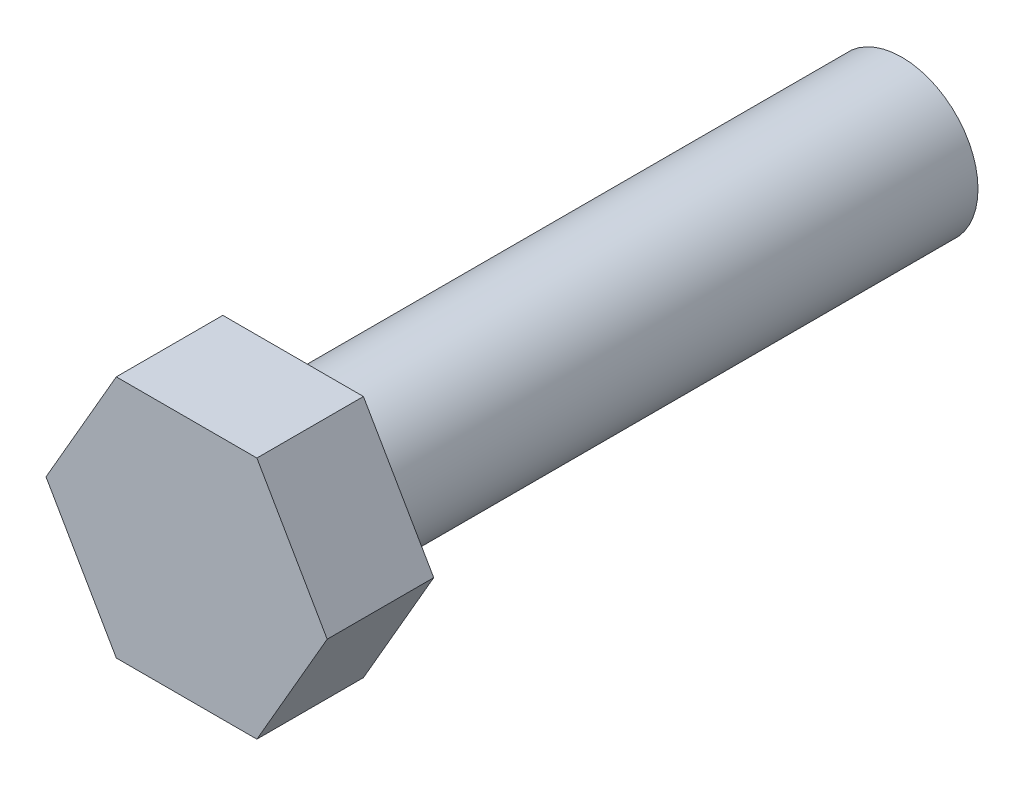
ISO-10303-21;
HEADER;
FILE_DESCRIPTION(('STEP AP214'),'2;1');
FILE_NAME('part.step','',(''),(''),'','','');
FILE_SCHEMA(('AUTOMOTIVE_DESIGN { 1 0 10303 214 1 1 1 1 }'));
ENDSEC;
DATA;
#1=APPLICATION_CONTEXT('core data for automotive mechanical design processes');
#2=APPLICATION_PROTOCOL_DEFINITION('international standard','automotive_design',2000,#1);
#3=PRODUCT_CONTEXT('',#1,'mechanical');
#4=PRODUCT('Part','Part','',(#3));
#5=PRODUCT_RELATED_PRODUCT_CATEGORY('part','',(#4));
#6=PRODUCT_DEFINITION_FORMATION('','',#4);
#7=PRODUCT_DEFINITION_CONTEXT('part definition',#1,'design');
#8=PRODUCT_DEFINITION('design','',#6,#7);
#9=PRODUCT_DEFINITION_SHAPE('','',#8);
#10=(LENGTH_UNIT() NAMED_UNIT(*) SI_UNIT(.MILLI.,.METRE.));
#11=(NAMED_UNIT(*) PLANE_ANGLE_UNIT() SI_UNIT($,.RADIAN.));
#12=(NAMED_UNIT(*) SI_UNIT($,.STERADIAN.) SOLID_ANGLE_UNIT());
#13=UNCERTAINTY_MEASURE_WITH_UNIT(LENGTH_MEASURE(1.E-05),#10,'distance_accuracy_value','');
#14=(GEOMETRIC_REPRESENTATION_CONTEXT(3) GLOBAL_UNCERTAINTY_ASSIGNED_CONTEXT((#13)) GLOBAL_UNIT_ASSIGNED_CONTEXT((#10,
#11,#12)) REPRESENTATION_CONTEXT('',''));
#15=CARTESIAN_POINT('',(0.,0.,0.));
#16=DIRECTION('',(0.,0.,1.));
#17=DIRECTION('',(1.,0.,0.));
#18=AXIS2_PLACEMENT_3D('',#15,#16,#17);
#19=CARTESIAN_POINT('',(0.,0.,0.));
#20=DIRECTION('',(0.,0.,1.));
#21=DIRECTION('',(1.,0.,0.));
#22=AXIS2_PLACEMENT_3D('',#19,#20,#21);
#23=PLANE('',#22);
#24=DIRECTION('',(0.5,0.866025403784439,0.));
#25=VECTOR('',#24,1.);
#26=CARTESIAN_POINT('',(2.30940107675851,-4.,0.));
#27=LINE('',#26,#25);
#28=CARTESIAN_POINT('',(2.30940107675851,-4.,0.));
#29=VERTEX_POINT('',#28);
#30=CARTESIAN_POINT('',(4.61880215351701,0.,0.));
#31=VERTEX_POINT('',#30);
#32=EDGE_CURVE('E118',#29,#31,#27,.T.);
#33=ORIENTED_EDGE('',*,*,#32,.F.);
#34=DIRECTION('',(1.,0.,0.));
#35=VECTOR('',#34,1.);
#36=CARTESIAN_POINT('',(-2.3094010767585,-4.,0.));
#37=LINE('',#36,#35);
#38=CARTESIAN_POINT('',(-2.3094010767585,-4.,0.));
#39=VERTEX_POINT('',#38);
#40=EDGE_CURVE('E78',#39,#29,#37,.T.);
#41=ORIENTED_EDGE('',*,*,#40,.F.);
#42=DIRECTION('',(0.5,-0.866025403784439,0.));
#43=VECTOR('',#42,1.);
#44=CARTESIAN_POINT('',(-4.61880215351701,0.,0.));
#45=LINE('',#44,#43);
#46=CARTESIAN_POINT('',(-4.61880215351701,0.,0.));
#47=VERTEX_POINT('',#46);
#48=EDGE_CURVE('E72',#47,#39,#45,.T.);
#49=ORIENTED_EDGE('',*,*,#48,.F.);
#50=DIRECTION('',(-0.5,-0.866025403784439,0.));
#51=VECTOR('',#50,1.);
#52=CARTESIAN_POINT('',(-2.3094010767585,4.,0.));
#53=LINE('',#52,#51);
#54=CARTESIAN_POINT('',(-2.3094010767585,4.,0.));
#55=VERTEX_POINT('',#54);
#56=EDGE_CURVE('E108',#55,#47,#53,.T.);
#57=ORIENTED_EDGE('',*,*,#56,.F.);
#58=DIRECTION('',(-1.,0.,0.));
#59=VECTOR('',#58,1.);
#60=CARTESIAN_POINT('',(2.3094010767585,4.,0.));
#61=LINE('',#60,#59);
#62=CARTESIAN_POINT('',(2.3094010767585,4.,0.));
#63=VERTEX_POINT('',#62);
#64=EDGE_CURVE('E124',#63,#55,#61,.T.);
#65=ORIENTED_EDGE('',*,*,#64,.F.);
#66=DIRECTION('',(-0.500000000000001,0.866025403784438,0.));
#67=VECTOR('',#66,1.);
#68=CARTESIAN_POINT('',(4.61880215351701,0.,0.));
#69=LINE('',#68,#67);
#70=EDGE_CURVE('E121',#31,#63,#69,.T.);
#71=ORIENTED_EDGE('',*,*,#70,.F.);
#72=EDGE_LOOP('',(#33,#41,#49,#57,#65,#71));
#73=FACE_BOUND('',#72,.T.);
#74=CARTESIAN_POINT('',(0.,0.,0.));
#75=DIRECTION('',(0.,0.,1.));
#76=DIRECTION('',(1.,0.,0.));
#77=AXIS2_PLACEMENT_3D('',#74,#75,#76);
#78=CIRCLE('',#77,2.5);
#79=CARTESIAN_POINT('',(2.5,0.,0.));
#80=VERTEX_POINT('',#79);
#81=EDGE_CURVE('E11',#80,#80,#78,.F.);
#82=ORIENTED_EDGE('',*,*,#81,.F.);
#83=EDGE_LOOP('',(#82));
#84=FACE_BOUND('',#83,.T.);
#85=ADVANCED_FACE('F32',(#73,#84),#23,.F.);
#86=CARTESIAN_POINT('',(2.30940107675851,-4.,3.5));
#87=DIRECTION('',(-0.866025403784439,0.5,0.));
#88=DIRECTION('',(-0.5,-0.866025403784439,0.));
#89=AXIS2_PLACEMENT_3D('',#86,#87,#88);
#90=PLANE('',#89);
#91=ORIENTED_EDGE('',*,*,#32,.T.);
#92=DIRECTION('',(0.,0.,-1.));
#93=VECTOR('',#92,1.);
#94=CARTESIAN_POINT('',(4.61880215351701,0.,3.5));
#95=LINE('',#94,#93);
#96=CARTESIAN_POINT('',(4.61880215351701,0.,3.5));
#97=VERTEX_POINT('',#96);
#98=EDGE_CURVE('E41',#97,#31,#95,.T.);
#99=ORIENTED_EDGE('',*,*,#98,.F.);
#100=DIRECTION('',(0.5,0.866025403784439,0.));
#101=VECTOR('',#100,1.);
#102=CARTESIAN_POINT('',(2.30940107675851,-4.,3.5));
#103=LINE('',#102,#101);
#104=CARTESIAN_POINT('',(2.30940107675851,-4.,3.5));
#105=VERTEX_POINT('',#104);
#106=EDGE_CURVE('E129',#105,#97,#103,.T.);
#107=ORIENTED_EDGE('',*,*,#106,.F.);
#108=DIRECTION('',(0.,0.,-1.));
#109=VECTOR('',#108,1.);
#110=CARTESIAN_POINT('',(2.30940107675851,-4.,3.5));
#111=LINE('',#110,#109);
#112=EDGE_CURVE('E114',#105,#29,#111,.T.);
#113=ORIENTED_EDGE('',*,*,#112,.T.);
#114=EDGE_LOOP('',(#91,#99,#107,#113));
#115=FACE_BOUND('',#114,.T.);
#116=ADVANCED_FACE('F34',(#115),#90,.F.);
#117=CARTESIAN_POINT('',(4.61880215351701,0.,3.5));
#118=DIRECTION('',(-0.866025403784438,-0.500000000000001,0.));
#119=DIRECTION('',(0.500000000000001,-0.866025403784438,0.));
#120=AXIS2_PLACEMENT_3D('',#117,#118,#119);
#121=PLANE('',#120);
#122=ORIENTED_EDGE('',*,*,#70,.T.);
#123=DIRECTION('',(0.,0.,-1.));
#124=VECTOR('',#123,1.);
#125=CARTESIAN_POINT('',(2.3094010767585,4.,3.5));
#126=LINE('',#125,#124);
#127=CARTESIAN_POINT('',(2.3094010767585,4.,3.5));
#128=VERTEX_POINT('',#127);
#129=EDGE_CURVE('E133',#128,#63,#126,.T.);
#130=ORIENTED_EDGE('',*,*,#129,.F.);
#131=DIRECTION('',(-0.500000000000001,0.866025403784438,0.));
#132=VECTOR('',#131,1.);
#133=CARTESIAN_POINT('',(4.61880215351701,0.,3.5));
#134=LINE('',#133,#132);
#135=EDGE_CURVE('E87',#97,#128,#134,.T.);
#136=ORIENTED_EDGE('',*,*,#135,.F.);
#137=ORIENTED_EDGE('',*,*,#98,.T.);
#138=EDGE_LOOP('',(#122,#130,#136,#137));
#139=FACE_BOUND('',#138,.T.);
#140=ADVANCED_FACE('F136',(#139),#121,.F.);
#141=CARTESIAN_POINT('',(2.3094010767585,4.,3.5));
#142=DIRECTION('',(0.,-1.,0.));
#143=DIRECTION('',(0.,0.,-1.));
#144=AXIS2_PLACEMENT_3D('',#141,#142,#143);
#145=PLANE('',#144);
#146=ORIENTED_EDGE('',*,*,#64,.T.);
#147=DIRECTION('',(0.,0.,-1.));
#148=VECTOR('',#147,1.);
#149=CARTESIAN_POINT('',(-2.3094010767585,4.,3.5));
#150=LINE('',#149,#148);
#151=CARTESIAN_POINT('',(-2.3094010767585,4.,3.5));
#152=VERTEX_POINT('',#151);
#153=EDGE_CURVE('E109',#152,#55,#150,.T.);
#154=ORIENTED_EDGE('',*,*,#153,.F.);
#155=DIRECTION('',(-1.,0.,0.));
#156=VECTOR('',#155,1.);
#157=CARTESIAN_POINT('',(2.3094010767585,4.,3.5));
#158=LINE('',#157,#156);
#159=EDGE_CURVE('E100',#128,#152,#158,.T.);
#160=ORIENTED_EDGE('',*,*,#159,.F.);
#161=ORIENTED_EDGE('',*,*,#129,.T.);
#162=EDGE_LOOP('',(#146,#154,#160,#161));
#163=FACE_BOUND('',#162,.T.);
#164=ADVANCED_FACE('F144',(#163),#145,.F.);
#165=CARTESIAN_POINT('',(-2.3094010767585,4.,3.5));
#166=DIRECTION('',(0.866025403784439,-0.5,0.));
#167=DIRECTION('',(0.5,0.866025403784439,0.));
#168=AXIS2_PLACEMENT_3D('',#165,#166,#167);
#169=PLANE('',#168);
#170=ORIENTED_EDGE('',*,*,#56,.T.);
#171=DIRECTION('',(0.,0.,-1.));
#172=VECTOR('',#171,1.);
#173=CARTESIAN_POINT('',(-4.61880215351701,0.,3.5));
#174=LINE('',#173,#172);
#175=CARTESIAN_POINT('',(-4.61880215351701,0.,3.5));
#176=VERTEX_POINT('',#175);
#177=EDGE_CURVE('E105',#176,#47,#174,.T.);
#178=ORIENTED_EDGE('',*,*,#177,.F.);
#179=DIRECTION('',(-0.5,-0.866025403784439,0.));
#180=VECTOR('',#179,1.);
#181=CARTESIAN_POINT('',(-2.3094010767585,4.,3.5));
#182=LINE('',#181,#180);
#183=EDGE_CURVE('E94',#152,#176,#182,.T.);
#184=ORIENTED_EDGE('',*,*,#183,.F.);
#185=ORIENTED_EDGE('',*,*,#153,.T.);
#186=EDGE_LOOP('',(#170,#178,#184,#185));
#187=FACE_BOUND('',#186,.T.);
#188=ADVANCED_FACE('F106',(#187),#169,.F.);
#189=CARTESIAN_POINT('',(-4.61880215351701,0.,3.5));
#190=DIRECTION('',(0.866025403784439,0.5,0.));
#191=DIRECTION('',(-0.5,0.866025403784439,0.));
#192=AXIS2_PLACEMENT_3D('',#189,#190,#191);
#193=PLANE('',#192);
#194=ORIENTED_EDGE('',*,*,#48,.T.);
#195=DIRECTION('',(0.,0.,-1.));
#196=VECTOR('',#195,1.);
#197=CARTESIAN_POINT('',(-2.3094010767585,-4.,3.5));
#198=LINE('',#197,#196);
#199=CARTESIAN_POINT('',(-2.3094010767585,-4.,3.5));
#200=VERTEX_POINT('',#199);
#201=EDGE_CURVE('E110',#200,#39,#198,.T.);
#202=ORIENTED_EDGE('',*,*,#201,.F.);
#203=DIRECTION('',(0.5,-0.866025403784439,0.));
#204=VECTOR('',#203,1.);
#205=CARTESIAN_POINT('',(-4.61880215351701,0.,3.5));
#206=LINE('',#205,#204);
#207=EDGE_CURVE('E98',#176,#200,#206,.T.);
#208=ORIENTED_EDGE('',*,*,#207,.F.);
#209=ORIENTED_EDGE('',*,*,#177,.T.);
#210=EDGE_LOOP('',(#194,#202,#208,#209));
#211=FACE_BOUND('',#210,.T.);
#212=ADVANCED_FACE('F112',(#211),#193,.F.);
#213=CARTESIAN_POINT('',(-2.3094010767585,-4.,3.5));
#214=DIRECTION('',(0.,1.,0.));
#215=DIRECTION('',(0.,0.,1.));
#216=AXIS2_PLACEMENT_3D('',#213,#214,#215);
#217=PLANE('',#216);
#218=ORIENTED_EDGE('',*,*,#40,.T.);
#219=ORIENTED_EDGE('',*,*,#112,.F.);
#220=DIRECTION('',(1.,0.,0.));
#221=VECTOR('',#220,1.);
#222=CARTESIAN_POINT('',(-2.3094010767585,-4.,3.5));
#223=LINE('',#222,#221);
#224=EDGE_CURVE('E49',#200,#105,#223,.T.);
#225=ORIENTED_EDGE('',*,*,#224,.F.);
#226=ORIENTED_EDGE('',*,*,#201,.T.);
#227=EDGE_LOOP('',(#218,#219,#225,#226));
#228=FACE_BOUND('',#227,.T.);
#229=ADVANCED_FACE('F165',(#228),#217,.F.);
#230=CARTESIAN_POINT('',(0.,0.,3.5));
#231=DIRECTION('',(0.,0.,1.));
#232=DIRECTION('',(1.,0.,0.));
#233=AXIS2_PLACEMENT_3D('',#230,#231,#232);
#234=PLANE('',#233);
#235=ORIENTED_EDGE('',*,*,#106,.T.);
#236=ORIENTED_EDGE('',*,*,#135,.T.);
#237=ORIENTED_EDGE('',*,*,#159,.T.);
#238=ORIENTED_EDGE('',*,*,#183,.T.);
#239=ORIENTED_EDGE('',*,*,#207,.T.);
#240=ORIENTED_EDGE('',*,*,#224,.T.);
#241=EDGE_LOOP('',(#235,#236,#237,#238,#239,#240));
#242=FACE_BOUND('',#241,.T.);
#243=ADVANCED_FACE('F96',(#242),#234,.T.);
#244=CARTESIAN_POINT('',(0.,0.,-20.));
#245=DIRECTION('',(0.,0.,1.));
#246=DIRECTION('',(1.,0.,0.));
#247=AXIS2_PLACEMENT_3D('',#244,#245,#246);
#248=CYLINDRICAL_SURFACE('',#247,2.5);
#249=CARTESIAN_POINT('',(0.,0.,-20.));
#250=DIRECTION('',(0.,0.,-1.));
#251=DIRECTION('',(-1.,0.,0.));
#252=AXIS2_PLACEMENT_3D('',#249,#250,#251);
#253=CIRCLE('',#252,2.5);
#254=CARTESIAN_POINT('',(-2.5,0.,-20.));
#255=VERTEX_POINT('',#254);
#256=EDGE_CURVE('E122',#255,#255,#253,.T.);
#257=ORIENTED_EDGE('',*,*,#256,.F.);
#258=EDGE_LOOP('',(#257));
#259=FACE_BOUND('',#258,.T.);
#260=ORIENTED_EDGE('',*,*,#81,.T.);
#261=EDGE_LOOP('',(#260));
#262=FACE_BOUND('',#261,.T.);
#263=ADVANCED_FACE('F153',(#259,#262),#248,.T.);
#264=CARTESIAN_POINT('',(0.,0.,-20.));
#265=DIRECTION('',(0.,0.,-1.));
#266=DIRECTION('',(-1.,0.,0.));
#267=AXIS2_PLACEMENT_3D('',#264,#265,#266);
#268=PLANE('',#267);
#269=ORIENTED_EDGE('',*,*,#256,.T.);
#270=EDGE_LOOP('',(#269));
#271=FACE_BOUND('',#270,.T.);
#272=ADVANCED_FACE('F151',(#271),#268,.T.);
#273=CLOSED_SHELL('',(#85,#116,#140,#164,#188,#212,#229,#243,#263,#272));
#274=MANIFOLD_SOLID_BREP('B2',#273);
#275=ADVANCED_BREP_SHAPE_REPRESENTATION('',(#18,#274),#14);
#276=SHAPE_DEFINITION_REPRESENTATION(#9,#275);
ENDSEC;
END-ISO-10303-21;
